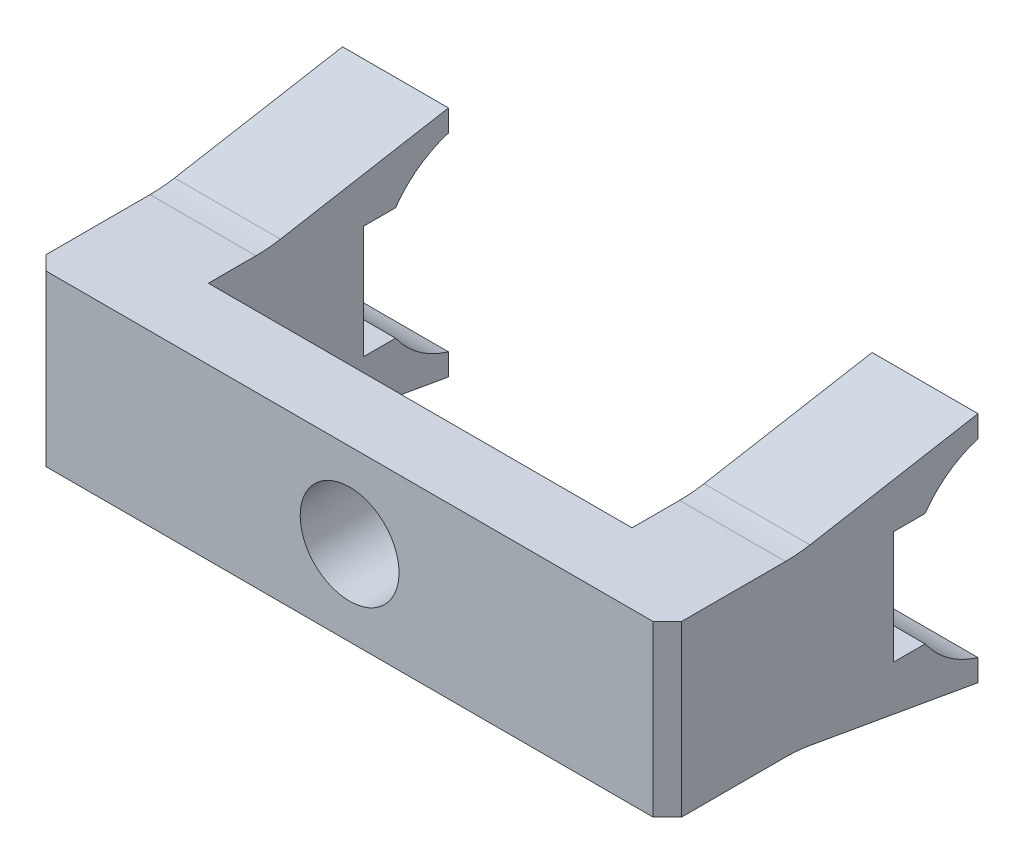
ISO-10303-21;
HEADER;
FILE_DESCRIPTION(('STEP AP214'),'2;1');
FILE_NAME('part.step','',(''),(''),'','','');
FILE_SCHEMA(('AUTOMOTIVE_DESIGN { 1 0 10303 214 1 1 1 1 }'));
ENDSEC;
DATA;
#1=APPLICATION_CONTEXT('core data for automotive mechanical design processes');
#2=APPLICATION_PROTOCOL_DEFINITION('international standard','automotive_design',2000,#1);
#3=PRODUCT_CONTEXT('',#1,'mechanical');
#4=PRODUCT('Part','Part','',(#3));
#5=PRODUCT_RELATED_PRODUCT_CATEGORY('part','',(#4));
#6=PRODUCT_DEFINITION_FORMATION('','',#4);
#7=PRODUCT_DEFINITION_CONTEXT('part definition',#1,'design');
#8=PRODUCT_DEFINITION('design','',#6,#7);
#9=PRODUCT_DEFINITION_SHAPE('','',#8);
#10=(LENGTH_UNIT() NAMED_UNIT(*) SI_UNIT(.MILLI.,.METRE.));
#11=(NAMED_UNIT(*) PLANE_ANGLE_UNIT() SI_UNIT($,.RADIAN.));
#12=(NAMED_UNIT(*) SI_UNIT($,.STERADIAN.) SOLID_ANGLE_UNIT());
#13=UNCERTAINTY_MEASURE_WITH_UNIT(LENGTH_MEASURE(1.E-05),#10,'distance_accuracy_value','');
#14=(GEOMETRIC_REPRESENTATION_CONTEXT(3) GLOBAL_UNCERTAINTY_ASSIGNED_CONTEXT((#13)) GLOBAL_UNIT_ASSIGNED_CONTEXT((#10,
#11,#12)) REPRESENTATION_CONTEXT('',''));
#15=CARTESIAN_POINT('',(0.,0.,0.));
#16=DIRECTION('',(0.,0.,1.));
#17=DIRECTION('',(1.,0.,0.));
#18=AXIS2_PLACEMENT_3D('',#15,#16,#17);
#19=CARTESIAN_POINT('',(0.,0.,0.));
#20=DIRECTION('',(0.,0.,-1.));
#21=DIRECTION('',(-1.,0.,0.));
#22=AXIS2_PLACEMENT_3D('',#19,#20,#21);
#23=PLANE('',#22);
#24=CARTESIAN_POINT('',(0.,0.,0.));
#25=DIRECTION('',(0.,0.,-1.));
#26=DIRECTION('',(-1.,0.,0.));
#27=AXIS2_PLACEMENT_3D('',#24,#25,#26);
#28=CIRCLE('',#27,3.5);
#29=CARTESIAN_POINT('',(-3.5,0.,0.));
#30=VERTEX_POINT('',#29);
#31=EDGE_CURVE('E259',#30,#30,#28,.T.);
#32=ORIENTED_EDGE('',*,*,#31,.F.);
#33=EDGE_LOOP('',(#32));
#34=FACE_BOUND('',#33,.T.);
#35=DIRECTION('',(0.,-1.,0.));
#36=VECTOR('',#35,1.);
#37=CARTESIAN_POINT('',(-15.,6.,0.));
#38=LINE('',#37,#36);
#39=CARTESIAN_POINT('',(-15.,6.,0.));
#40=VERTEX_POINT('',#39);
#41=CARTESIAN_POINT('',(-15.,-6.,0.));
#42=VERTEX_POINT('',#41);
#43=EDGE_CURVE('E272',#40,#42,#38,.T.);
#44=ORIENTED_EDGE('',*,*,#43,.F.);
#45=DIRECTION('',(-1.,0.,0.));
#46=VECTOR('',#45,1.);
#47=CARTESIAN_POINT('',(-22.5,6.,0.));
#48=LINE('',#47,#46);
#49=CARTESIAN_POINT('',(15.,6.,0.));
#50=VERTEX_POINT('',#49);
#51=EDGE_CURVE('E434',#50,#40,#48,.T.);
#52=ORIENTED_EDGE('',*,*,#51,.F.);
#53=DIRECTION('',(0.,-1.,0.));
#54=VECTOR('',#53,1.);
#55=CARTESIAN_POINT('',(15.,6.,0.));
#56=LINE('',#55,#54);
#57=CARTESIAN_POINT('',(15.,-6.,0.));
#58=VERTEX_POINT('',#57);
#59=EDGE_CURVE('E393',#50,#58,#56,.T.);
#60=ORIENTED_EDGE('',*,*,#59,.T.);
#61=DIRECTION('',(1.,0.,0.));
#62=VECTOR('',#61,1.);
#63=CARTESIAN_POINT('',(-22.5,-6.,0.));
#64=LINE('',#63,#62);
#65=EDGE_CURVE('E461',#42,#58,#64,.T.);
#66=ORIENTED_EDGE('',*,*,#65,.F.);
#67=EDGE_LOOP('',(#44,#52,#60,#66));
#68=FACE_BOUND('',#67,.T.);
#69=ADVANCED_FACE('F37',(#34,#68),#23,.T.);
#70=CARTESIAN_POINT('',(22.5,-6.,5.));
#71=DIRECTION('',(-1.,0.,0.));
#72=DIRECTION('',(0.,0.,1.));
#73=AXIS2_PLACEMENT_3D('',#70,#71,#72);
#74=PLANE('',#73);
#75=DIRECTION('',(0.,0.,-1.));
#76=VECTOR('',#75,1.);
#77=CARTESIAN_POINT('',(22.5,6.,5.));
#78=LINE('',#77,#76);
#79=CARTESIAN_POINT('',(22.5,6.,3.99999999999999));
#80=VERTEX_POINT('',#79);
#81=CARTESIAN_POINT('',(22.5,6.,-3.36472927060098));
#82=VERTEX_POINT('',#81);
#83=EDGE_CURVE('E473',#80,#82,#78,.T.);
#84=ORIENTED_EDGE('',*,*,#83,.F.);
#85=DIRECTION('',(0.,-1.,0.));
#86=VECTOR('',#85,1.);
#87=CARTESIAN_POINT('',(22.5,-6.,3.99999999999999));
#88=LINE('',#87,#86);
#89=CARTESIAN_POINT('',(22.5,-6.,3.99999999999999));
#90=VERTEX_POINT('',#89);
#91=EDGE_CURVE('E11',#80,#90,#88,.T.);
#92=ORIENTED_EDGE('',*,*,#91,.T.);
#93=DIRECTION('',(0.,0.,-1.));
#94=VECTOR('',#93,1.);
#95=CARTESIAN_POINT('',(22.5,-6.,5.));
#96=LINE('',#95,#94);
#97=CARTESIAN_POINT('',(22.5,-6.,-3.36472927060098));
#98=VERTEX_POINT('',#97);
#99=EDGE_CURVE('E464',#90,#98,#96,.T.);
#100=ORIENTED_EDGE('',*,*,#99,.T.);
#101=CARTESIAN_POINT('',(22.5,-16.,-3.36472927060098));
#102=DIRECTION('',(-1.,0.,0.));
#103=DIRECTION('',(0.,0.,1.));
#104=AXIS2_PLACEMENT_3D('',#101,#102,#103);
#105=CIRCLE('',#104,10.);
#106=CARTESIAN_POINT('',(22.5,-6.15192246987792,-5.10121104727029));
#107=VERTEX_POINT('',#106);
#108=EDGE_CURVE('E323',#98,#107,#105,.T.);
#109=ORIENTED_EDGE('',*,*,#108,.T.);
#110=DIRECTION('',(0.,-0.173648177666932,-0.984807753012208));
#111=VECTOR('',#110,1.);
#112=CARTESIAN_POINT('',(22.5,-8.25,-17.));
#113=LINE('',#112,#111);
#114=CARTESIAN_POINT('',(22.5,-8.25,-17.));
#115=VERTEX_POINT('',#114);
#116=EDGE_CURVE('E402',#107,#115,#113,.T.);
#117=ORIENTED_EDGE('',*,*,#116,.T.);
#118=DIRECTION('',(0.,1.,0.));
#119=VECTOR('',#118,1.);
#120=CARTESIAN_POINT('',(22.5,-6.70820393249937,-17.));
#121=LINE('',#120,#119);
#122=CARTESIAN_POINT('',(22.5,-6.70820393249937,-17.));
#123=VERTEX_POINT('',#122);
#124=EDGE_CURVE('E405',#115,#123,#121,.T.);
#125=ORIENTED_EDGE('',*,*,#124,.T.);
#126=CARTESIAN_POINT('',(22.5,0.,-19.));
#127=DIRECTION('',(-1.,0.,0.));
#128=DIRECTION('',(0.,0.,-1.));
#129=AXIS2_PLACEMENT_3D('',#126,#127,#128);
#130=CIRCLE('',#129,7.);
#131=CARTESIAN_POINT('',(22.5,-4.,-13.255437353462));
#132=VERTEX_POINT('',#131);
#133=EDGE_CURVE('E408',#123,#132,#130,.T.);
#134=ORIENTED_EDGE('',*,*,#133,.T.);
#135=DIRECTION('',(0.,0.,1.));
#136=VECTOR('',#135,1.);
#137=CARTESIAN_POINT('',(22.5,-4.,-11.));
#138=LINE('',#137,#136);
#139=CARTESIAN_POINT('',(22.5,-4.,-11.));
#140=VERTEX_POINT('',#139);
#141=EDGE_CURVE('E411',#132,#140,#138,.T.);
#142=ORIENTED_EDGE('',*,*,#141,.T.);
#143=DIRECTION('',(0.,1.,0.));
#144=VECTOR('',#143,1.);
#145=CARTESIAN_POINT('',(22.5,4.,-11.));
#146=LINE('',#145,#144);
#147=CARTESIAN_POINT('',(22.5,4.,-11.));
#148=VERTEX_POINT('',#147);
#149=EDGE_CURVE('E414',#140,#148,#146,.T.);
#150=ORIENTED_EDGE('',*,*,#149,.T.);
#151=DIRECTION('',(0.,0.,-1.));
#152=VECTOR('',#151,1.);
#153=CARTESIAN_POINT('',(22.5,4.,-11.));
#154=LINE('',#153,#152);
#155=CARTESIAN_POINT('',(22.5,4.,-13.255437353462));
#156=VERTEX_POINT('',#155);
#157=EDGE_CURVE('E417',#148,#156,#154,.T.);
#158=ORIENTED_EDGE('',*,*,#157,.T.);
#159=CARTESIAN_POINT('',(22.5,0.,-19.));
#160=DIRECTION('',(-1.,0.,0.));
#161=DIRECTION('',(0.,0.,-1.));
#162=AXIS2_PLACEMENT_3D('',#159,#160,#161);
#163=CIRCLE('',#162,7.);
#164=CARTESIAN_POINT('',(22.5,6.70820393249937,-17.));
#165=VERTEX_POINT('',#164);
#166=EDGE_CURVE('E420',#156,#165,#163,.T.);
#167=ORIENTED_EDGE('',*,*,#166,.T.);
#168=DIRECTION('',(0.,1.,0.));
#169=VECTOR('',#168,1.);
#170=CARTESIAN_POINT('',(22.5,8.25,-17.));
#171=LINE('',#170,#169);
#172=CARTESIAN_POINT('',(22.5,8.25,-17.));
#173=VERTEX_POINT('',#172);
#174=EDGE_CURVE('E423',#165,#173,#171,.T.);
#175=ORIENTED_EDGE('',*,*,#174,.T.);
#176=DIRECTION('',(0.,-0.173648177666932,0.984807753012208));
#177=VECTOR('',#176,1.);
#178=CARTESIAN_POINT('',(22.5,8.25,-17.));
#179=LINE('',#178,#177);
#180=CARTESIAN_POINT('',(22.5,6.15192246987792,-5.10121104727028));
#181=VERTEX_POINT('',#180);
#182=EDGE_CURVE('E426',#173,#181,#179,.T.);
#183=ORIENTED_EDGE('',*,*,#182,.T.);
#184=CARTESIAN_POINT('',(22.5,16.,-3.36472927060098));
#185=DIRECTION('',(-1.,0.,0.));
#186=DIRECTION('',(0.,0.,-1.));
#187=AXIS2_PLACEMENT_3D('',#184,#185,#186);
#188=CIRCLE('',#187,10.);
#189=EDGE_CURVE('E360',#181,#82,#188,.T.);
#190=ORIENTED_EDGE('',*,*,#189,.T.);
#191=EDGE_LOOP('',(#84,#92,#100,#109,#117,#125,#134,#142,#150,#158,#167,#175,#183,#190));
#192=FACE_BOUND('',#191,.T.);
#193=ADVANCED_FACE('F522',(#192),#74,.F.);
#194=CARTESIAN_POINT('',(-22.5,6.,5.));
#195=DIRECTION('',(0.,-1.,0.));
#196=DIRECTION('',(1.,0.,0.));
#197=AXIS2_PLACEMENT_3D('',#194,#195,#196);
#198=PLANE('',#197);
#199=DIRECTION('',(0.,0.,-1.));
#200=VECTOR('',#199,1.);
#201=CARTESIAN_POINT('',(-22.5,6.,5.));
#202=LINE('',#201,#200);
#203=CARTESIAN_POINT('',(-22.5,6.,3.99999999999999));
#204=VERTEX_POINT('',#203);
#205=CARTESIAN_POINT('',(-22.5,6.,-3.36472927060098));
#206=VERTEX_POINT('',#205);
#207=EDGE_CURVE('E471',#204,#206,#202,.T.);
#208=ORIENTED_EDGE('',*,*,#207,.F.);
#209=DIRECTION('',(-0.707106781186548,0.,-0.707106781186548));
#210=VECTOR('',#209,1.);
#211=CARTESIAN_POINT('',(-21.5,6.,5.));
#212=LINE('',#211,#210);
#213=CARTESIAN_POINT('',(-21.5,6.,5.));
#214=VERTEX_POINT('',#213);
#215=EDGE_CURVE('E45',#204,#214,#212,.F.);
#216=ORIENTED_EDGE('',*,*,#215,.T.);
#217=DIRECTION('',(-1.,0.,0.));
#218=VECTOR('',#217,1.);
#219=CARTESIAN_POINT('',(-22.5,6.,5.));
#220=LINE('',#219,#218);
#221=CARTESIAN_POINT('',(21.5,6.,5.));
#222=VERTEX_POINT('',#221);
#223=EDGE_CURVE('E457',#222,#214,#220,.T.);
#224=ORIENTED_EDGE('',*,*,#223,.F.);
#225=DIRECTION('',(-0.707106781186548,0.,0.707106781186548));
#226=VECTOR('',#225,1.);
#227=CARTESIAN_POINT('',(21.5,6.,5.));
#228=LINE('',#227,#226);
#229=EDGE_CURVE('E52',#222,#80,#228,.F.);
#230=ORIENTED_EDGE('',*,*,#229,.T.);
#231=ORIENTED_EDGE('',*,*,#83,.T.);
#232=DIRECTION('',(1.,0.,0.));
#233=VECTOR('',#232,1.);
#234=CARTESIAN_POINT('',(15.,6.,-3.36472927060098));
#235=LINE('',#234,#233);
#236=CARTESIAN_POINT('',(15.,6.,-3.36472927060098));
#237=VERTEX_POINT('',#236);
#238=EDGE_CURVE('E435',#237,#82,#235,.T.);
#239=ORIENTED_EDGE('',*,*,#238,.F.);
#240=DIRECTION('',(0.,0.,1.));
#241=VECTOR('',#240,1.);
#242=CARTESIAN_POINT('',(15.,6.,0.));
#243=LINE('',#242,#241);
#244=EDGE_CURVE('E390',#237,#50,#243,.T.);
#245=ORIENTED_EDGE('',*,*,#244,.T.);
#246=ORIENTED_EDGE('',*,*,#51,.T.);
#247=DIRECTION('',(0.,0.,1.));
#248=VECTOR('',#247,1.);
#249=CARTESIAN_POINT('',(-15.,6.,0.));
#250=LINE('',#249,#248);
#251=CARTESIAN_POINT('',(-15.,6.,-3.36472927060098));
#252=VERTEX_POINT('',#251);
#253=EDGE_CURVE('E275',#252,#40,#250,.T.);
#254=ORIENTED_EDGE('',*,*,#253,.F.);
#255=DIRECTION('',(-1.,0.,0.));
#256=VECTOR('',#255,1.);
#257=CARTESIAN_POINT('',(-15.,6.,-3.36472927060098));
#258=LINE('',#257,#256);
#259=EDGE_CURVE('E351',#252,#206,#258,.T.);
#260=ORIENTED_EDGE('',*,*,#259,.T.);
#261=EDGE_LOOP('',(#208,#216,#224,#230,#231,#239,#245,#246,#254,#260));
#262=FACE_BOUND('',#261,.T.);
#263=ADVANCED_FACE('F487',(#262),#198,.F.);
#264=CARTESIAN_POINT('',(-22.5,-6.,5.));
#265=DIRECTION('',(1.,0.,0.));
#266=DIRECTION('',(0.,0.,-1.));
#267=AXIS2_PLACEMENT_3D('',#264,#265,#266);
#268=PLANE('',#267);
#269=DIRECTION('',(0.,0.,-1.));
#270=VECTOR('',#269,1.);
#271=CARTESIAN_POINT('',(-22.5,-6.,5.));
#272=LINE('',#271,#270);
#273=CARTESIAN_POINT('',(-22.5,-6.,3.99999999999999));
#274=VERTEX_POINT('',#273);
#275=CARTESIAN_POINT('',(-22.5,-6.,-3.36472927060098));
#276=VERTEX_POINT('',#275);
#277=EDGE_CURVE('E469',#274,#276,#272,.T.);
#278=ORIENTED_EDGE('',*,*,#277,.F.);
#279=DIRECTION('',(0.,1.,0.));
#280=VECTOR('',#279,1.);
#281=CARTESIAN_POINT('',(-22.5,-6.,3.99999999999999));
#282=LINE('',#281,#280);
#283=EDGE_CURVE('E60',#274,#204,#282,.T.);
#284=ORIENTED_EDGE('',*,*,#283,.T.);
#285=ORIENTED_EDGE('',*,*,#207,.T.);
#286=CARTESIAN_POINT('',(-22.5,16.,-3.36472927060098));
#287=DIRECTION('',(-1.,0.,0.));
#288=DIRECTION('',(0.,0.,-1.));
#289=AXIS2_PLACEMENT_3D('',#286,#287,#288);
#290=CIRCLE('',#289,10.);
#291=CARTESIAN_POINT('',(-22.5,6.15192246987792,-5.10121104727028));
#292=VERTEX_POINT('',#291);
#293=EDGE_CURVE('E300',#292,#206,#290,.T.);
#294=ORIENTED_EDGE('',*,*,#293,.F.);
#295=DIRECTION('',(0.,-0.173648177666932,0.984807753012208));
#296=VECTOR('',#295,1.);
#297=CARTESIAN_POINT('',(-22.5,8.25,-17.));
#298=LINE('',#297,#296);
#299=CARTESIAN_POINT('',(-22.5,8.25,-17.));
#300=VERTEX_POINT('',#299);
#301=EDGE_CURVE('E303',#300,#292,#298,.T.);
#302=ORIENTED_EDGE('',*,*,#301,.F.);
#303=DIRECTION('',(0.,1.,0.));
#304=VECTOR('',#303,1.);
#305=CARTESIAN_POINT('',(-22.5,8.25,-17.));
#306=LINE('',#305,#304);
#307=CARTESIAN_POINT('',(-22.5,6.70820393249937,-17.));
#308=VERTEX_POINT('',#307);
#309=EDGE_CURVE('E305',#308,#300,#306,.T.);
#310=ORIENTED_EDGE('',*,*,#309,.F.);
#311=CARTESIAN_POINT('',(-22.5,0.,-19.));
#312=DIRECTION('',(-1.,0.,0.));
#313=DIRECTION('',(0.,0.,-1.));
#314=AXIS2_PLACEMENT_3D('',#311,#312,#313);
#315=CIRCLE('',#314,7.);
#316=CARTESIAN_POINT('',(-22.5,4.,-13.255437353462));
#317=VERTEX_POINT('',#316);
#318=EDGE_CURVE('E307',#317,#308,#315,.T.);
#319=ORIENTED_EDGE('',*,*,#318,.F.);
#320=DIRECTION('',(0.,0.,-1.));
#321=VECTOR('',#320,1.);
#322=CARTESIAN_POINT('',(-22.5,4.,-11.));
#323=LINE('',#322,#321);
#324=CARTESIAN_POINT('',(-22.5,4.,-11.));
#325=VERTEX_POINT('',#324);
#326=EDGE_CURVE('E309',#325,#317,#323,.T.);
#327=ORIENTED_EDGE('',*,*,#326,.F.);
#328=DIRECTION('',(0.,1.,0.));
#329=VECTOR('',#328,1.);
#330=CARTESIAN_POINT('',(-22.5,4.,-11.));
#331=LINE('',#330,#329);
#332=CARTESIAN_POINT('',(-22.5,-4.,-11.));
#333=VERTEX_POINT('',#332);
#334=EDGE_CURVE('E311',#333,#325,#331,.T.);
#335=ORIENTED_EDGE('',*,*,#334,.F.);
#336=DIRECTION('',(0.,0.,1.));
#337=VECTOR('',#336,1.);
#338=CARTESIAN_POINT('',(-22.5,-4.,-11.));
#339=LINE('',#338,#337);
#340=CARTESIAN_POINT('',(-22.5,-4.,-13.255437353462));
#341=VERTEX_POINT('',#340);
#342=EDGE_CURVE('E313',#341,#333,#339,.T.);
#343=ORIENTED_EDGE('',*,*,#342,.F.);
#344=CARTESIAN_POINT('',(-22.5,0.,-19.));
#345=DIRECTION('',(-1.,0.,0.));
#346=DIRECTION('',(0.,0.,-1.));
#347=AXIS2_PLACEMENT_3D('',#344,#345,#346);
#348=CIRCLE('',#347,7.);
#349=CARTESIAN_POINT('',(-22.5,-6.70820393249937,-17.));
#350=VERTEX_POINT('',#349);
#351=EDGE_CURVE('E315',#350,#341,#348,.T.);
#352=ORIENTED_EDGE('',*,*,#351,.F.);
#353=DIRECTION('',(0.,1.,0.));
#354=VECTOR('',#353,1.);
#355=CARTESIAN_POINT('',(-22.5,-6.70820393249937,-17.));
#356=LINE('',#355,#354);
#357=CARTESIAN_POINT('',(-22.5,-8.25,-17.));
#358=VERTEX_POINT('',#357);
#359=EDGE_CURVE('E317',#358,#350,#356,.T.);
#360=ORIENTED_EDGE('',*,*,#359,.F.);
#361=DIRECTION('',(0.,-0.173648177666932,-0.984807753012208));
#362=VECTOR('',#361,1.);
#363=CARTESIAN_POINT('',(-22.5,-8.25,-17.));
#364=LINE('',#363,#362);
#365=CARTESIAN_POINT('',(-22.5,-6.15192246987792,-5.10121104727029));
#366=VERTEX_POINT('',#365);
#367=EDGE_CURVE('E270',#366,#358,#364,.T.);
#368=ORIENTED_EDGE('',*,*,#367,.F.);
#369=CARTESIAN_POINT('',(-22.5,-16.,-3.36472927060098));
#370=DIRECTION('',(-1.,0.,0.));
#371=DIRECTION('',(0.,0.,1.));
#372=AXIS2_PLACEMENT_3D('',#369,#370,#371);
#373=CIRCLE('',#372,10.);
#374=EDGE_CURVE('E263',#276,#366,#373,.T.);
#375=ORIENTED_EDGE('',*,*,#374,.F.);
#376=EDGE_LOOP('',(#278,#284,#285,#294,#302,#310,#319,#327,#335,#343,#352,#360,#368,#375));
#377=FACE_BOUND('',#376,.T.);
#378=ADVANCED_FACE('F499',(#377),#268,.F.);
#379=CARTESIAN_POINT('',(-22.5,-6.,5.));
#380=DIRECTION('',(0.,1.,0.));
#381=DIRECTION('',(0.,0.,1.));
#382=AXIS2_PLACEMENT_3D('',#379,#380,#381);
#383=PLANE('',#382);
#384=DIRECTION('',(1.,0.,0.));
#385=VECTOR('',#384,1.);
#386=CARTESIAN_POINT('',(-22.5,-6.,5.));
#387=LINE('',#386,#385);
#388=CARTESIAN_POINT('',(-21.5,-6.,5.));
#389=VERTEX_POINT('',#388);
#390=CARTESIAN_POINT('',(21.5,-6.,5.));
#391=VERTEX_POINT('',#390);
#392=EDGE_CURVE('E460',#389,#391,#387,.T.);
#393=ORIENTED_EDGE('',*,*,#392,.F.);
#394=DIRECTION('',(0.707106781186548,0.,0.707106781186548));
#395=VECTOR('',#394,1.);
#396=CARTESIAN_POINT('',(-21.5,-6.,5.));
#397=LINE('',#396,#395);
#398=EDGE_CURVE('E483',#389,#274,#397,.F.);
#399=ORIENTED_EDGE('',*,*,#398,.T.);
#400=ORIENTED_EDGE('',*,*,#277,.T.);
#401=DIRECTION('',(-1.,0.,0.));
#402=VECTOR('',#401,1.);
#403=CARTESIAN_POINT('',(-15.,-6.,-3.36472927060098));
#404=LINE('',#403,#402);
#405=CARTESIAN_POINT('',(-15.,-6.,-3.36472927060098));
#406=VERTEX_POINT('',#405);
#407=EDGE_CURVE('E297',#406,#276,#404,.T.);
#408=ORIENTED_EDGE('',*,*,#407,.F.);
#409=DIRECTION('',(0.,0.,-1.));
#410=VECTOR('',#409,1.);
#411=CARTESIAN_POINT('',(-15.,-6.,0.));
#412=LINE('',#411,#410);
#413=EDGE_CURVE('E269',#42,#406,#412,.T.);
#414=ORIENTED_EDGE('',*,*,#413,.F.);
#415=ORIENTED_EDGE('',*,*,#65,.T.);
#416=DIRECTION('',(0.,0.,-1.));
#417=VECTOR('',#416,1.);
#418=CARTESIAN_POINT('',(15.,-6.,0.));
#419=LINE('',#418,#417);
#420=CARTESIAN_POINT('',(15.,-6.,-3.36472927060098));
#421=VERTEX_POINT('',#420);
#422=EDGE_CURVE('E396',#58,#421,#419,.T.);
#423=ORIENTED_EDGE('',*,*,#422,.T.);
#424=DIRECTION('',(1.,0.,0.));
#425=VECTOR('',#424,1.);
#426=CARTESIAN_POINT('',(15.,-6.,-3.36472927060098));
#427=LINE('',#426,#425);
#428=EDGE_CURVE('E431',#421,#98,#427,.T.);
#429=ORIENTED_EDGE('',*,*,#428,.T.);
#430=ORIENTED_EDGE('',*,*,#99,.F.);
#431=DIRECTION('',(0.707106781186548,0.,-0.707106781186548));
#432=VECTOR('',#431,1.);
#433=CARTESIAN_POINT('',(21.5,-6.,5.));
#434=LINE('',#433,#432);
#435=EDGE_CURVE('E481',#90,#391,#434,.F.);
#436=ORIENTED_EDGE('',*,*,#435,.T.);
#437=EDGE_LOOP('',(#393,#399,#400,#408,#414,#415,#423,#429,#430,#436));
#438=FACE_BOUND('',#437,.T.);
#439=ADVANCED_FACE('F496',(#438),#383,.F.);
#440=CARTESIAN_POINT('',(0.,0.,5.));
#441=DIRECTION('',(0.,0.,-1.));
#442=DIRECTION('',(-1.,0.,0.));
#443=AXIS2_PLACEMENT_3D('',#440,#441,#442);
#444=PLANE('',#443);
#445=CARTESIAN_POINT('',(0.,0.,5.));
#446=DIRECTION('',(0.,0.,-1.));
#447=DIRECTION('',(-1.,0.,0.));
#448=AXIS2_PLACEMENT_3D('',#445,#446,#447);
#449=CIRCLE('',#448,3.5);
#450=CARTESIAN_POINT('',(-3.5,0.,5.));
#451=VERTEX_POINT('',#450);
#452=EDGE_CURVE('E260',#451,#451,#449,.T.);
#453=ORIENTED_EDGE('',*,*,#452,.T.);
#454=EDGE_LOOP('',(#453));
#455=FACE_BOUND('',#454,.T.);
#456=ORIENTED_EDGE('',*,*,#223,.T.);
#457=DIRECTION('',(0.,-1.,0.));
#458=VECTOR('',#457,1.);
#459=CARTESIAN_POINT('',(-21.5,0.,5.));
#460=LINE('',#459,#458);
#461=EDGE_CURVE('E478',#214,#389,#460,.T.);
#462=ORIENTED_EDGE('',*,*,#461,.T.);
#463=ORIENTED_EDGE('',*,*,#392,.T.);
#464=DIRECTION('',(0.,1.,0.));
#465=VECTOR('',#464,1.);
#466=CARTESIAN_POINT('',(21.5,0.,5.));
#467=LINE('',#466,#465);
#468=EDGE_CURVE('E475',#391,#222,#467,.T.);
#469=ORIENTED_EDGE('',*,*,#468,.T.);
#470=EDGE_LOOP('',(#456,#462,#463,#469));
#471=FACE_BOUND('',#470,.T.);
#472=ADVANCED_FACE('F491',(#455,#471),#444,.F.);
#473=CARTESIAN_POINT('',(15.,-16.,-3.36472927060098));
#474=DIRECTION('',(1.,0.,0.));
#475=DIRECTION('',(0.,0.,-1.));
#476=AXIS2_PLACEMENT_3D('',#473,#474,#475);
#477=CYLINDRICAL_SURFACE('',#476,10.);
#478=ORIENTED_EDGE('',*,*,#108,.F.);
#479=ORIENTED_EDGE('',*,*,#428,.F.);
#480=CARTESIAN_POINT('',(15.,-16.,-3.36472927060098));
#481=DIRECTION('',(-1.,0.,0.));
#482=DIRECTION('',(0.,0.,1.));
#483=AXIS2_PLACEMENT_3D('',#480,#481,#482);
#484=CIRCLE('',#483,10.);
#485=CARTESIAN_POINT('',(15.,-6.15192246987792,-5.10121104727029));
#486=VERTEX_POINT('',#485);
#487=EDGE_CURVE('E356',#421,#486,#484,.T.);
#488=ORIENTED_EDGE('',*,*,#487,.T.);
#489=DIRECTION('',(1.,0.,0.));
#490=VECTOR('',#489,1.);
#491=CARTESIAN_POINT('',(15.,-6.15192246987792,-5.10121104727029));
#492=LINE('',#491,#490);
#493=EDGE_CURVE('E399',#486,#107,#492,.T.);
#494=ORIENTED_EDGE('',*,*,#493,.T.);
#495=EDGE_LOOP('',(#478,#479,#488,#494));
#496=FACE_BOUND('',#495,.T.);
#497=ADVANCED_FACE('F562',(#496),#477,.F.);
#498=CARTESIAN_POINT('',(15.,16.,-3.36472927060098));
#499=DIRECTION('',(1.,0.,0.));
#500=DIRECTION('',(0.,0.,-1.));
#501=AXIS2_PLACEMENT_3D('',#498,#499,#500);
#502=CYLINDRICAL_SURFACE('',#501,10.);
#503=ORIENTED_EDGE('',*,*,#189,.F.);
#504=DIRECTION('',(1.,0.,0.));
#505=VECTOR('',#504,1.);
#506=CARTESIAN_POINT('',(15.,6.15192246987792,-5.10121104727028));
#507=LINE('',#506,#505);
#508=CARTESIAN_POINT('',(15.,6.15192246987792,-5.10121104727028));
#509=VERTEX_POINT('',#508);
#510=EDGE_CURVE('E438',#509,#181,#507,.T.);
#511=ORIENTED_EDGE('',*,*,#510,.F.);
#512=CARTESIAN_POINT('',(15.,16.,-3.36472927060098));
#513=DIRECTION('',(-1.,0.,0.));
#514=DIRECTION('',(0.,0.,-1.));
#515=AXIS2_PLACEMENT_3D('',#512,#513,#514);
#516=CIRCLE('',#515,10.);
#517=EDGE_CURVE('E387',#509,#237,#516,.T.);
#518=ORIENTED_EDGE('',*,*,#517,.T.);
#519=ORIENTED_EDGE('',*,*,#238,.T.);
#520=EDGE_LOOP('',(#503,#511,#518,#519));
#521=FACE_BOUND('',#520,.T.);
#522=ADVANCED_FACE('F520',(#521),#502,.F.);
#523=CARTESIAN_POINT('',(15.,8.25,-17.));
#524=DIRECTION('',(0.,0.984807753012208,0.173648177666932));
#525=DIRECTION('',(0.,-0.173648177666932,0.984807753012208));
#526=AXIS2_PLACEMENT_3D('',#523,#524,#525);
#527=PLANE('',#526);
#528=ORIENTED_EDGE('',*,*,#182,.F.);
#529=DIRECTION('',(1.,0.,0.));
#530=VECTOR('',#529,1.);
#531=CARTESIAN_POINT('',(15.,8.25,-17.));
#532=LINE('',#531,#530);
#533=CARTESIAN_POINT('',(15.,8.25,-17.));
#534=VERTEX_POINT('',#533);
#535=EDGE_CURVE('E440',#534,#173,#532,.T.);
#536=ORIENTED_EDGE('',*,*,#535,.F.);
#537=DIRECTION('',(0.,-0.173648177666932,0.984807753012208));
#538=VECTOR('',#537,1.);
#539=CARTESIAN_POINT('',(15.,8.25,-17.));
#540=LINE('',#539,#538);
#541=EDGE_CURVE('E384',#534,#509,#540,.T.);
#542=ORIENTED_EDGE('',*,*,#541,.T.);
#543=ORIENTED_EDGE('',*,*,#510,.T.);
#544=EDGE_LOOP('',(#528,#536,#542,#543));
#545=FACE_BOUND('',#544,.T.);
#546=ADVANCED_FACE('F527',(#545),#527,.T.);
#547=CARTESIAN_POINT('',(15.,8.25,-17.));
#548=DIRECTION('',(0.,0.,-1.));
#549=DIRECTION('',(0.,1.,0.));
#550=AXIS2_PLACEMENT_3D('',#547,#548,#549);
#551=PLANE('',#550);
#552=ORIENTED_EDGE('',*,*,#174,.F.);
#553=DIRECTION('',(1.,0.,0.));
#554=VECTOR('',#553,1.);
#555=CARTESIAN_POINT('',(15.,6.70820393249937,-17.));
#556=LINE('',#555,#554);
#557=CARTESIAN_POINT('',(15.,6.70820393249937,-17.));
#558=VERTEX_POINT('',#557);
#559=EDGE_CURVE('E442',#558,#165,#556,.T.);
#560=ORIENTED_EDGE('',*,*,#559,.F.);
#561=DIRECTION('',(0.,1.,0.));
#562=VECTOR('',#561,1.);
#563=CARTESIAN_POINT('',(15.,8.25,-17.));
#564=LINE('',#563,#562);
#565=EDGE_CURVE('E381',#558,#534,#564,.T.);
#566=ORIENTED_EDGE('',*,*,#565,.T.);
#567=ORIENTED_EDGE('',*,*,#535,.T.);
#568=EDGE_LOOP('',(#552,#560,#566,#567));
#569=FACE_BOUND('',#568,.T.);
#570=ADVANCED_FACE('F532',(#569),#551,.T.);
#571=CARTESIAN_POINT('',(15.,0.,-19.));
#572=DIRECTION('',(1.,0.,0.));
#573=DIRECTION('',(0.,0.,-1.));
#574=AXIS2_PLACEMENT_3D('',#571,#572,#573);
#575=CYLINDRICAL_SURFACE('',#574,7.);
#576=ORIENTED_EDGE('',*,*,#166,.F.);
#577=DIRECTION('',(1.,0.,0.));
#578=VECTOR('',#577,1.);
#579=CARTESIAN_POINT('',(15.,4.,-13.255437353462));
#580=LINE('',#579,#578);
#581=CARTESIAN_POINT('',(15.,4.,-13.255437353462));
#582=VERTEX_POINT('',#581);
#583=EDGE_CURVE('E444',#582,#156,#580,.T.);
#584=ORIENTED_EDGE('',*,*,#583,.F.);
#585=CARTESIAN_POINT('',(15.,0.,-19.));
#586=DIRECTION('',(-1.,0.,0.));
#587=DIRECTION('',(0.,0.,-1.));
#588=AXIS2_PLACEMENT_3D('',#585,#586,#587);
#589=CIRCLE('',#588,7.);
#590=EDGE_CURVE('E378',#582,#558,#589,.T.);
#591=ORIENTED_EDGE('',*,*,#590,.T.);
#592=ORIENTED_EDGE('',*,*,#559,.T.);
#593=EDGE_LOOP('',(#576,#584,#591,#592));
#594=FACE_BOUND('',#593,.T.);
#595=ADVANCED_FACE('F535',(#594),#575,.F.);
#596=CARTESIAN_POINT('',(15.,4.,-11.));
#597=DIRECTION('',(0.,-1.,0.));
#598=DIRECTION('',(0.,0.,-1.));
#599=AXIS2_PLACEMENT_3D('',#596,#597,#598);
#600=PLANE('',#599);
#601=ORIENTED_EDGE('',*,*,#157,.F.);
#602=DIRECTION('',(1.,0.,0.));
#603=VECTOR('',#602,1.);
#604=CARTESIAN_POINT('',(15.,4.,-11.));
#605=LINE('',#604,#603);
#606=CARTESIAN_POINT('',(15.,4.,-11.));
#607=VERTEX_POINT('',#606);
#608=EDGE_CURVE('E446',#607,#148,#605,.T.);
#609=ORIENTED_EDGE('',*,*,#608,.F.);
#610=DIRECTION('',(0.,0.,-1.));
#611=VECTOR('',#610,1.);
#612=CARTESIAN_POINT('',(15.,4.,-11.));
#613=LINE('',#612,#611);
#614=EDGE_CURVE('E375',#607,#582,#613,.T.);
#615=ORIENTED_EDGE('',*,*,#614,.T.);
#616=ORIENTED_EDGE('',*,*,#583,.T.);
#617=EDGE_LOOP('',(#601,#609,#615,#616));
#618=FACE_BOUND('',#617,.T.);
#619=ADVANCED_FACE('F540',(#618),#600,.T.);
#620=CARTESIAN_POINT('',(15.,4.,-11.));
#621=DIRECTION('',(0.,0.,-1.));
#622=DIRECTION('',(0.,1.,0.));
#623=AXIS2_PLACEMENT_3D('',#620,#621,#622);
#624=PLANE('',#623);
#625=CARTESIAN_POINT('',(19.,0.,-11.));
#626=DIRECTION('',(0.,0.,-1.));
#627=DIRECTION('',(0.,1.,0.));
#628=AXIS2_PLACEMENT_3D('',#625,#626,#627);
#629=CIRCLE('',#628,2.49999999999999);
#630=CARTESIAN_POINT('',(19.,2.49999999999999,-11.));
#631=VERTEX_POINT('',#630);
#632=EDGE_CURVE('E248',#631,#631,#629,.T.);
#633=ORIENTED_EDGE('',*,*,#632,.F.);
#634=EDGE_LOOP('',(#633));
#635=FACE_BOUND('',#634,.T.);
#636=ORIENTED_EDGE('',*,*,#149,.F.);
#637=DIRECTION('',(1.,0.,0.));
#638=VECTOR('',#637,1.);
#639=CARTESIAN_POINT('',(15.,-4.,-11.));
#640=LINE('',#639,#638);
#641=CARTESIAN_POINT('',(15.,-4.,-11.));
#642=VERTEX_POINT('',#641);
#643=EDGE_CURVE('E448',#642,#140,#640,.T.);
#644=ORIENTED_EDGE('',*,*,#643,.F.);
#645=DIRECTION('',(0.,1.,0.));
#646=VECTOR('',#645,1.);
#647=CARTESIAN_POINT('',(15.,4.,-11.));
#648=LINE('',#647,#646);
#649=EDGE_CURVE('E372',#642,#607,#648,.T.);
#650=ORIENTED_EDGE('',*,*,#649,.T.);
#651=ORIENTED_EDGE('',*,*,#608,.T.);
#652=EDGE_LOOP('',(#636,#644,#650,#651));
#653=FACE_BOUND('',#652,.T.);
#654=ADVANCED_FACE('F543',(#635,#653),#624,.T.);
#655=CARTESIAN_POINT('',(15.,-4.,-11.));
#656=DIRECTION('',(0.,1.,0.));
#657=DIRECTION('',(0.,0.,1.));
#658=AXIS2_PLACEMENT_3D('',#655,#656,#657);
#659=PLANE('',#658);
#660=ORIENTED_EDGE('',*,*,#141,.F.);
#661=DIRECTION('',(1.,0.,0.));
#662=VECTOR('',#661,1.);
#663=CARTESIAN_POINT('',(15.,-4.,-13.255437353462));
#664=LINE('',#663,#662);
#665=CARTESIAN_POINT('',(15.,-4.,-13.255437353462));
#666=VERTEX_POINT('',#665);
#667=EDGE_CURVE('E450',#666,#132,#664,.T.);
#668=ORIENTED_EDGE('',*,*,#667,.F.);
#669=DIRECTION('',(0.,0.,1.));
#670=VECTOR('',#669,1.);
#671=CARTESIAN_POINT('',(15.,-4.,-11.));
#672=LINE('',#671,#670);
#673=EDGE_CURVE('E369',#666,#642,#672,.T.);
#674=ORIENTED_EDGE('',*,*,#673,.T.);
#675=ORIENTED_EDGE('',*,*,#643,.T.);
#676=EDGE_LOOP('',(#660,#668,#674,#675));
#677=FACE_BOUND('',#676,.T.);
#678=ADVANCED_FACE('F548',(#677),#659,.T.);
#679=CARTESIAN_POINT('',(15.,0.,-19.));
#680=DIRECTION('',(1.,0.,0.));
#681=DIRECTION('',(0.,0.,-1.));
#682=AXIS2_PLACEMENT_3D('',#679,#680,#681);
#683=CYLINDRICAL_SURFACE('',#682,7.);
#684=ORIENTED_EDGE('',*,*,#133,.F.);
#685=DIRECTION('',(1.,0.,0.));
#686=VECTOR('',#685,1.);
#687=CARTESIAN_POINT('',(15.,-6.70820393249937,-17.));
#688=LINE('',#687,#686);
#689=CARTESIAN_POINT('',(15.,-6.70820393249937,-17.));
#690=VERTEX_POINT('',#689);
#691=EDGE_CURVE('E452',#690,#123,#688,.T.);
#692=ORIENTED_EDGE('',*,*,#691,.F.);
#693=CARTESIAN_POINT('',(15.,0.,-19.));
#694=DIRECTION('',(-1.,0.,0.));
#695=DIRECTION('',(0.,0.,-1.));
#696=AXIS2_PLACEMENT_3D('',#693,#694,#695);
#697=CIRCLE('',#696,7.);
#698=EDGE_CURVE('E366',#690,#666,#697,.T.);
#699=ORIENTED_EDGE('',*,*,#698,.T.);
#700=ORIENTED_EDGE('',*,*,#667,.T.);
#701=EDGE_LOOP('',(#684,#692,#699,#700));
#702=FACE_BOUND('',#701,.T.);
#703=ADVANCED_FACE('F551',(#702),#683,.F.);
#704=CARTESIAN_POINT('',(15.,-6.70820393249937,-17.));
#705=DIRECTION('',(0.,0.,-1.));
#706=DIRECTION('',(0.,1.,0.));
#707=AXIS2_PLACEMENT_3D('',#704,#705,#706);
#708=PLANE('',#707);
#709=ORIENTED_EDGE('',*,*,#124,.F.);
#710=DIRECTION('',(1.,0.,0.));
#711=VECTOR('',#710,1.);
#712=CARTESIAN_POINT('',(15.,-8.25,-17.));
#713=LINE('',#712,#711);
#714=CARTESIAN_POINT('',(15.,-8.25,-17.));
#715=VERTEX_POINT('',#714);
#716=EDGE_CURVE('E454',#715,#115,#713,.T.);
#717=ORIENTED_EDGE('',*,*,#716,.F.);
#718=DIRECTION('',(0.,1.,0.));
#719=VECTOR('',#718,1.);
#720=CARTESIAN_POINT('',(15.,-6.70820393249937,-17.));
#721=LINE('',#720,#719);
#722=EDGE_CURVE('E363',#715,#690,#721,.T.);
#723=ORIENTED_EDGE('',*,*,#722,.T.);
#724=ORIENTED_EDGE('',*,*,#691,.T.);
#725=EDGE_LOOP('',(#709,#717,#723,#724));
#726=FACE_BOUND('',#725,.T.);
#727=ADVANCED_FACE('F556',(#726),#708,.T.);
#728=CARTESIAN_POINT('',(15.,-8.25,-17.));
#729=DIRECTION('',(0.,-0.984807753012208,0.173648177666932));
#730=DIRECTION('',(0.,-0.173648177666932,-0.984807753012208));
#731=AXIS2_PLACEMENT_3D('',#728,#729,#730);
#732=PLANE('',#731);
#733=ORIENTED_EDGE('',*,*,#116,.F.);
#734=ORIENTED_EDGE('',*,*,#493,.F.);
#735=DIRECTION('',(0.,-0.173648177666932,-0.984807753012208));
#736=VECTOR('',#735,1.);
#737=CARTESIAN_POINT('',(15.,-8.25,-17.));
#738=LINE('',#737,#736);
#739=EDGE_CURVE('E359',#486,#715,#738,.T.);
#740=ORIENTED_EDGE('',*,*,#739,.T.);
#741=ORIENTED_EDGE('',*,*,#716,.T.);
#742=EDGE_LOOP('',(#733,#734,#740,#741));
#743=FACE_BOUND('',#742,.T.);
#744=ADVANCED_FACE('F559',(#743),#732,.T.);
#745=CARTESIAN_POINT('',(15.,-16.,-3.36472927060098));
#746=DIRECTION('',(-1.,0.,0.));
#747=DIRECTION('',(0.,0.,1.));
#748=AXIS2_PLACEMENT_3D('',#745,#746,#747);
#749=PLANE('',#748);
#750=ORIENTED_EDGE('',*,*,#487,.F.);
#751=ORIENTED_EDGE('',*,*,#422,.F.);
#752=ORIENTED_EDGE('',*,*,#59,.F.);
#753=ORIENTED_EDGE('',*,*,#244,.F.);
#754=ORIENTED_EDGE('',*,*,#517,.F.);
#755=ORIENTED_EDGE('',*,*,#541,.F.);
#756=ORIENTED_EDGE('',*,*,#565,.F.);
#757=ORIENTED_EDGE('',*,*,#590,.F.);
#758=ORIENTED_EDGE('',*,*,#614,.F.);
#759=ORIENTED_EDGE('',*,*,#649,.F.);
#760=ORIENTED_EDGE('',*,*,#673,.F.);
#761=ORIENTED_EDGE('',*,*,#698,.F.);
#762=ORIENTED_EDGE('',*,*,#722,.F.);
#763=ORIENTED_EDGE('',*,*,#739,.F.);
#764=EDGE_LOOP('',(#750,#751,#752,#753,#754,#755,#756,#757,#758,#759,#760,#761,#762,#763));
#765=FACE_BOUND('',#764,.T.);
#766=ADVANCED_FACE('F516',(#765),#749,.T.);
#767=CARTESIAN_POINT('',(-15.,-16.,-3.36472927060098));
#768=DIRECTION('',(-1.,0.,0.));
#769=DIRECTION('',(0.,0.,1.));
#770=AXIS2_PLACEMENT_3D('',#767,#768,#769);
#771=CYLINDRICAL_SURFACE('',#770,10.);
#772=ORIENTED_EDGE('',*,*,#374,.T.);
#773=DIRECTION('',(-1.,0.,0.));
#774=VECTOR('',#773,1.);
#775=CARTESIAN_POINT('',(-15.,-6.15192246987792,-5.10121104727029));
#776=LINE('',#775,#774);
#777=CARTESIAN_POINT('',(-15.,-6.15192246987792,-5.10121104727029));
#778=VERTEX_POINT('',#777);
#779=EDGE_CURVE('E320',#778,#366,#776,.T.);
#780=ORIENTED_EDGE('',*,*,#779,.F.);
#781=CARTESIAN_POINT('',(-15.,-16.,-3.36472927060098));
#782=DIRECTION('',(-1.,0.,0.));
#783=DIRECTION('',(0.,0.,1.));
#784=AXIS2_PLACEMENT_3D('',#781,#782,#783);
#785=CIRCLE('',#784,10.);
#786=EDGE_CURVE('E266',#406,#778,#785,.T.);
#787=ORIENTED_EDGE('',*,*,#786,.F.);
#788=ORIENTED_EDGE('',*,*,#407,.T.);
#789=EDGE_LOOP('',(#772,#780,#787,#788));
#790=FACE_BOUND('',#789,.T.);
#791=ADVANCED_FACE('F503',(#790),#771,.F.);
#792=CARTESIAN_POINT('',(-15.,-8.25,-17.));
#793=DIRECTION('',(0.,0.984807753012208,-0.173648177666932));
#794=DIRECTION('',(0.,0.173648177666932,0.984807753012208));
#795=AXIS2_PLACEMENT_3D('',#792,#793,#794);
#796=PLANE('',#795);
#797=ORIENTED_EDGE('',*,*,#367,.T.);
#798=DIRECTION('',(-1.,0.,0.));
#799=VECTOR('',#798,1.);
#800=CARTESIAN_POINT('',(-15.,-8.25,-17.));
#801=LINE('',#800,#799);
#802=CARTESIAN_POINT('',(-15.,-8.25,-17.));
#803=VERTEX_POINT('',#802);
#804=EDGE_CURVE('E324',#803,#358,#801,.T.);
#805=ORIENTED_EDGE('',*,*,#804,.F.);
#806=DIRECTION('',(0.,-0.173648177666932,-0.984807753012208));
#807=VECTOR('',#806,1.);
#808=CARTESIAN_POINT('',(-15.,-8.25,-17.));
#809=LINE('',#808,#807);
#810=EDGE_CURVE('E295',#778,#803,#809,.T.);
#811=ORIENTED_EDGE('',*,*,#810,.F.);
#812=ORIENTED_EDGE('',*,*,#779,.T.);
#813=EDGE_LOOP('',(#797,#805,#811,#812));
#814=FACE_BOUND('',#813,.T.);
#815=ADVANCED_FACE('F685',(#814),#796,.F.);
#816=CARTESIAN_POINT('',(-15.,-6.70820393249937,-17.));
#817=DIRECTION('',(0.,0.,1.));
#818=DIRECTION('',(0.,-1.,0.));
#819=AXIS2_PLACEMENT_3D('',#816,#817,#818);
#820=PLANE('',#819);
#821=ORIENTED_EDGE('',*,*,#359,.T.);
#822=DIRECTION('',(-1.,0.,0.));
#823=VECTOR('',#822,1.);
#824=CARTESIAN_POINT('',(-15.,-6.70820393249937,-17.));
#825=LINE('',#824,#823);
#826=CARTESIAN_POINT('',(-15.,-6.70820393249937,-17.));
#827=VERTEX_POINT('',#826);
#828=EDGE_CURVE('E327',#827,#350,#825,.T.);
#829=ORIENTED_EDGE('',*,*,#828,.F.);
#830=DIRECTION('',(0.,1.,0.));
#831=VECTOR('',#830,1.);
#832=CARTESIAN_POINT('',(-15.,-6.70820393249937,-17.));
#833=LINE('',#832,#831);
#834=EDGE_CURVE('E293',#803,#827,#833,.T.);
#835=ORIENTED_EDGE('',*,*,#834,.F.);
#836=ORIENTED_EDGE('',*,*,#804,.T.);
#837=EDGE_LOOP('',(#821,#829,#835,#836));
#838=FACE_BOUND('',#837,.T.);
#839=ADVANCED_FACE('F692',(#838),#820,.F.);
#840=CARTESIAN_POINT('',(-15.,0.,-19.));
#841=DIRECTION('',(-1.,0.,0.));
#842=DIRECTION('',(0.,0.,1.));
#843=AXIS2_PLACEMENT_3D('',#840,#841,#842);
#844=CYLINDRICAL_SURFACE('',#843,7.);
#845=ORIENTED_EDGE('',*,*,#351,.T.);
#846=DIRECTION('',(-1.,0.,0.));
#847=VECTOR('',#846,1.);
#848=CARTESIAN_POINT('',(-15.,-4.,-13.255437353462));
#849=LINE('',#848,#847);
#850=CARTESIAN_POINT('',(-15.,-4.,-13.255437353462));
#851=VERTEX_POINT('',#850);
#852=EDGE_CURVE('E330',#851,#341,#849,.T.);
#853=ORIENTED_EDGE('',*,*,#852,.F.);
#854=CARTESIAN_POINT('',(-15.,0.,-19.));
#855=DIRECTION('',(-1.,0.,0.));
#856=DIRECTION('',(0.,0.,-1.));
#857=AXIS2_PLACEMENT_3D('',#854,#855,#856);
#858=CIRCLE('',#857,7.);
#859=EDGE_CURVE('E291',#827,#851,#858,.T.);
#860=ORIENTED_EDGE('',*,*,#859,.F.);
#861=ORIENTED_EDGE('',*,*,#828,.T.);
#862=EDGE_LOOP('',(#845,#853,#860,#861));
#863=FACE_BOUND('',#862,.T.);
#864=ADVANCED_FACE('F700',(#863),#844,.F.);
#865=CARTESIAN_POINT('',(-15.,-4.,-11.));
#866=DIRECTION('',(0.,-1.,0.));
#867=DIRECTION('',(0.,0.,-1.));
#868=AXIS2_PLACEMENT_3D('',#865,#866,#867);
#869=PLANE('',#868);
#870=ORIENTED_EDGE('',*,*,#342,.T.);
#871=DIRECTION('',(-1.,0.,0.));
#872=VECTOR('',#871,1.);
#873=CARTESIAN_POINT('',(-15.,-4.,-11.));
#874=LINE('',#873,#872);
#875=CARTESIAN_POINT('',(-15.,-4.,-11.));
#876=VERTEX_POINT('',#875);
#877=EDGE_CURVE('E333',#876,#333,#874,.T.);
#878=ORIENTED_EDGE('',*,*,#877,.F.);
#879=DIRECTION('',(0.,0.,1.));
#880=VECTOR('',#879,1.);
#881=CARTESIAN_POINT('',(-15.,-4.,-11.));
#882=LINE('',#881,#880);
#883=EDGE_CURVE('E289',#851,#876,#882,.T.);
#884=ORIENTED_EDGE('',*,*,#883,.F.);
#885=ORIENTED_EDGE('',*,*,#852,.T.);
#886=EDGE_LOOP('',(#870,#878,#884,#885));
#887=FACE_BOUND('',#886,.T.);
#888=ADVANCED_FACE('F708',(#887),#869,.F.);
#889=CARTESIAN_POINT('',(-15.,4.,-11.));
#890=DIRECTION('',(0.,0.,1.));
#891=DIRECTION('',(0.,-1.,0.));
#892=AXIS2_PLACEMENT_3D('',#889,#890,#891);
#893=PLANE('',#892);
#894=CARTESIAN_POINT('',(-19.,0.,-11.));
#895=DIRECTION('',(0.,0.,-1.));
#896=DIRECTION('',(0.,1.,0.));
#897=AXIS2_PLACEMENT_3D('',#894,#895,#896);
#898=CIRCLE('',#897,2.49999999999999);
#899=CARTESIAN_POINT('',(-19.,2.49999999999999,-11.));
#900=VERTEX_POINT('',#899);
#901=EDGE_CURVE('E249',#900,#900,#898,.T.);
#902=ORIENTED_EDGE('',*,*,#901,.F.);
#903=EDGE_LOOP('',(#902));
#904=FACE_BOUND('',#903,.T.);
#905=ORIENTED_EDGE('',*,*,#334,.T.);
#906=DIRECTION('',(-1.,0.,0.));
#907=VECTOR('',#906,1.);
#908=CARTESIAN_POINT('',(-15.,4.,-11.));
#909=LINE('',#908,#907);
#910=CARTESIAN_POINT('',(-15.,4.,-11.));
#911=VERTEX_POINT('',#910);
#912=EDGE_CURVE('E336',#911,#325,#909,.T.);
#913=ORIENTED_EDGE('',*,*,#912,.F.);
#914=DIRECTION('',(0.,1.,0.));
#915=VECTOR('',#914,1.);
#916=CARTESIAN_POINT('',(-15.,4.,-11.));
#917=LINE('',#916,#915);
#918=EDGE_CURVE('E287',#876,#911,#917,.T.);
#919=ORIENTED_EDGE('',*,*,#918,.F.);
#920=ORIENTED_EDGE('',*,*,#877,.T.);
#921=EDGE_LOOP('',(#905,#913,#919,#920));
#922=FACE_BOUND('',#921,.T.);
#923=ADVANCED_FACE('F716',(#904,#922),#893,.F.);
#924=CARTESIAN_POINT('',(-15.,4.,-11.));
#925=DIRECTION('',(0.,1.,0.));
#926=DIRECTION('',(0.,0.,1.));
#927=AXIS2_PLACEMENT_3D('',#924,#925,#926);
#928=PLANE('',#927);
#929=ORIENTED_EDGE('',*,*,#326,.T.);
#930=DIRECTION('',(-1.,0.,0.));
#931=VECTOR('',#930,1.);
#932=CARTESIAN_POINT('',(-15.,4.,-13.255437353462));
#933=LINE('',#932,#931);
#934=CARTESIAN_POINT('',(-15.,4.,-13.255437353462));
#935=VERTEX_POINT('',#934);
#936=EDGE_CURVE('E339',#935,#317,#933,.T.);
#937=ORIENTED_EDGE('',*,*,#936,.F.);
#938=DIRECTION('',(0.,0.,-1.));
#939=VECTOR('',#938,1.);
#940=CARTESIAN_POINT('',(-15.,4.,-11.));
#941=LINE('',#940,#939);
#942=EDGE_CURVE('E285',#911,#935,#941,.T.);
#943=ORIENTED_EDGE('',*,*,#942,.F.);
#944=ORIENTED_EDGE('',*,*,#912,.T.);
#945=EDGE_LOOP('',(#929,#937,#943,#944));
#946=FACE_BOUND('',#945,.T.);
#947=ADVANCED_FACE('F725',(#946),#928,.F.);
#948=CARTESIAN_POINT('',(-15.,0.,-19.));
#949=DIRECTION('',(-1.,0.,0.));
#950=DIRECTION('',(0.,0.,1.));
#951=AXIS2_PLACEMENT_3D('',#948,#949,#950);
#952=CYLINDRICAL_SURFACE('',#951,7.);
#953=ORIENTED_EDGE('',*,*,#318,.T.);
#954=DIRECTION('',(-1.,0.,0.));
#955=VECTOR('',#954,1.);
#956=CARTESIAN_POINT('',(-15.,6.70820393249937,-17.));
#957=LINE('',#956,#955);
#958=CARTESIAN_POINT('',(-15.,6.70820393249937,-17.));
#959=VERTEX_POINT('',#958);
#960=EDGE_CURVE('E342',#959,#308,#957,.T.);
#961=ORIENTED_EDGE('',*,*,#960,.F.);
#962=CARTESIAN_POINT('',(-15.,0.,-19.));
#963=DIRECTION('',(-1.,0.,0.));
#964=DIRECTION('',(0.,0.,-1.));
#965=AXIS2_PLACEMENT_3D('',#962,#963,#964);
#966=CIRCLE('',#965,7.);
#967=EDGE_CURVE('E283',#935,#959,#966,.T.);
#968=ORIENTED_EDGE('',*,*,#967,.F.);
#969=ORIENTED_EDGE('',*,*,#936,.T.);
#970=EDGE_LOOP('',(#953,#961,#968,#969));
#971=FACE_BOUND('',#970,.T.);
#972=ADVANCED_FACE('F734',(#971),#952,.F.);
#973=CARTESIAN_POINT('',(-15.,8.25,-17.));
#974=DIRECTION('',(0.,0.,1.));
#975=DIRECTION('',(0.,-1.,0.));
#976=AXIS2_PLACEMENT_3D('',#973,#974,#975);
#977=PLANE('',#976);
#978=ORIENTED_EDGE('',*,*,#309,.T.);
#979=DIRECTION('',(-1.,0.,0.));
#980=VECTOR('',#979,1.);
#981=CARTESIAN_POINT('',(-15.,8.25,-17.));
#982=LINE('',#981,#980);
#983=CARTESIAN_POINT('',(-15.,8.25,-17.));
#984=VERTEX_POINT('',#983);
#985=EDGE_CURVE('E345',#984,#300,#982,.T.);
#986=ORIENTED_EDGE('',*,*,#985,.F.);
#987=DIRECTION('',(0.,1.,0.));
#988=VECTOR('',#987,1.);
#989=CARTESIAN_POINT('',(-15.,8.25,-17.));
#990=LINE('',#989,#988);
#991=EDGE_CURVE('E281',#959,#984,#990,.T.);
#992=ORIENTED_EDGE('',*,*,#991,.F.);
#993=ORIENTED_EDGE('',*,*,#960,.T.);
#994=EDGE_LOOP('',(#978,#986,#992,#993));
#995=FACE_BOUND('',#994,.T.);
#996=ADVANCED_FACE('F742',(#995),#977,.F.);
#997=CARTESIAN_POINT('',(-15.,8.25,-17.));
#998=DIRECTION('',(0.,-0.984807753012208,-0.173648177666932));
#999=DIRECTION('',(0.,0.173648177666932,-0.984807753012208));
#1000=AXIS2_PLACEMENT_3D('',#997,#998,#999);
#1001=PLANE('',#1000);
#1002=ORIENTED_EDGE('',*,*,#301,.T.);
#1003=DIRECTION('',(-1.,0.,0.));
#1004=VECTOR('',#1003,1.);
#1005=CARTESIAN_POINT('',(-15.,6.15192246987792,-5.10121104727028));
#1006=LINE('',#1005,#1004);
#1007=CARTESIAN_POINT('',(-15.,6.15192246987792,-5.10121104727028));
#1008=VERTEX_POINT('',#1007);
#1009=EDGE_CURVE('E348',#1008,#292,#1006,.T.);
#1010=ORIENTED_EDGE('',*,*,#1009,.F.);
#1011=DIRECTION('',(0.,-0.173648177666932,0.984807753012208));
#1012=VECTOR('',#1011,1.);
#1013=CARTESIAN_POINT('',(-15.,8.25,-17.));
#1014=LINE('',#1013,#1012);
#1015=EDGE_CURVE('E279',#984,#1008,#1014,.T.);
#1016=ORIENTED_EDGE('',*,*,#1015,.F.);
#1017=ORIENTED_EDGE('',*,*,#985,.T.);
#1018=EDGE_LOOP('',(#1002,#1010,#1016,#1017));
#1019=FACE_BOUND('',#1018,.T.);
#1020=ADVANCED_FACE('F750',(#1019),#1001,.F.);
#1021=CARTESIAN_POINT('',(-15.,16.,-3.36472927060098));
#1022=DIRECTION('',(-1.,0.,0.));
#1023=DIRECTION('',(0.,0.,1.));
#1024=AXIS2_PLACEMENT_3D('',#1021,#1022,#1023);
#1025=CYLINDRICAL_SURFACE('',#1024,10.);
#1026=ORIENTED_EDGE('',*,*,#293,.T.);
#1027=ORIENTED_EDGE('',*,*,#259,.F.);
#1028=CARTESIAN_POINT('',(-15.,16.,-3.36472927060098));
#1029=DIRECTION('',(-1.,0.,0.));
#1030=DIRECTION('',(0.,0.,-1.));
#1031=AXIS2_PLACEMENT_3D('',#1028,#1029,#1030);
#1032=CIRCLE('',#1031,10.);
#1033=EDGE_CURVE('E277',#1008,#252,#1032,.T.);
#1034=ORIENTED_EDGE('',*,*,#1033,.F.);
#1035=ORIENTED_EDGE('',*,*,#1009,.T.);
#1036=EDGE_LOOP('',(#1026,#1027,#1034,#1035));
#1037=FACE_BOUND('',#1036,.T.);
#1038=ADVANCED_FACE('F758',(#1037),#1025,.F.);
#1039=CARTESIAN_POINT('',(-15.,-16.,-3.36472927060098));
#1040=DIRECTION('',(1.,0.,0.));
#1041=DIRECTION('',(0.,0.,1.));
#1042=AXIS2_PLACEMENT_3D('',#1039,#1040,#1041);
#1043=PLANE('',#1042);
#1044=ORIENTED_EDGE('',*,*,#786,.T.);
#1045=ORIENTED_EDGE('',*,*,#810,.T.);
#1046=ORIENTED_EDGE('',*,*,#834,.T.);
#1047=ORIENTED_EDGE('',*,*,#859,.T.);
#1048=ORIENTED_EDGE('',*,*,#883,.T.);
#1049=ORIENTED_EDGE('',*,*,#918,.T.);
#1050=ORIENTED_EDGE('',*,*,#942,.T.);
#1051=ORIENTED_EDGE('',*,*,#967,.T.);
#1052=ORIENTED_EDGE('',*,*,#991,.T.);
#1053=ORIENTED_EDGE('',*,*,#1015,.T.);
#1054=ORIENTED_EDGE('',*,*,#1033,.T.);
#1055=ORIENTED_EDGE('',*,*,#253,.T.);
#1056=ORIENTED_EDGE('',*,*,#43,.T.);
#1057=ORIENTED_EDGE('',*,*,#413,.T.);
#1058=EDGE_LOOP('',(#1044,#1045,#1046,#1047,#1048,#1049,#1050,#1051,#1052,#1053,#1054,#1055,
#1056,#1057));
#1059=FACE_BOUND('',#1058,.T.);
#1060=ADVANCED_FACE('F509',(#1059),#1043,.T.);
#1061=CARTESIAN_POINT('',(0.,0.,5.));
#1062=DIRECTION('',(0.,0.,-1.));
#1063=DIRECTION('',(-1.,0.,0.));
#1064=AXIS2_PLACEMENT_3D('',#1061,#1062,#1063);
#1065=CYLINDRICAL_SURFACE('',#1064,3.5);
#1066=ORIENTED_EDGE('',*,*,#452,.F.);
#1067=EDGE_LOOP('',(#1066));
#1068=FACE_BOUND('',#1067,.T.);
#1069=ORIENTED_EDGE('',*,*,#31,.T.);
#1070=EDGE_LOOP('',(#1069));
#1071=FACE_BOUND('',#1070,.T.);
#1072=ADVANCED_FACE('F773',(#1068,#1071),#1065,.F.);
#1073=CARTESIAN_POINT('',(19.,0.,0.999999999999999));
#1074=DIRECTION('',(0.,0.,-1.));
#1075=DIRECTION('',(0.,1.,0.));
#1076=AXIS2_PLACEMENT_3D('',#1073,#1074,#1075);
#1077=CONICAL_SURFACE('',#1076,2.5,1.02974425867665);
#1078=CARTESIAN_POINT('',(19.,0.,2.5021515475689));
#1079=VERTEX_POINT('',#1078);
#1080=VERTEX_LOOP('',#1079);
#1081=FACE_BOUND('',#1080,.T.);
#1082=CARTESIAN_POINT('',(19.,0.,0.999999999999999));
#1083=DIRECTION('',(0.,0.,-1.));
#1084=DIRECTION('',(0.,1.,0.));
#1085=AXIS2_PLACEMENT_3D('',#1082,#1083,#1084);
#1086=CIRCLE('',#1085,2.5);
#1087=CARTESIAN_POINT('',(19.,2.5,1.));
#1088=VERTEX_POINT('',#1087);
#1089=EDGE_CURVE('E252',#1088,#1088,#1086,.T.);
#1090=ORIENTED_EDGE('',*,*,#1089,.T.);
#1091=EDGE_LOOP('',(#1090));
#1092=FACE_BOUND('',#1091,.T.);
#1093=ADVANCED_FACE('F779',(#1081,#1092),#1077,.F.);
#1094=CARTESIAN_POINT('',(19.,0.,-11.));
#1095=DIRECTION('',(0.,0.,-1.));
#1096=DIRECTION('',(0.,1.,0.));
#1097=AXIS2_PLACEMENT_3D('',#1094,#1095,#1096);
#1098=CYLINDRICAL_SURFACE('',#1097,2.5);
#1099=ORIENTED_EDGE('',*,*,#1089,.F.);
#1100=EDGE_LOOP('',(#1099));
#1101=FACE_BOUND('',#1100,.T.);
#1102=ORIENTED_EDGE('',*,*,#632,.T.);
#1103=EDGE_LOOP('',(#1102));
#1104=FACE_BOUND('',#1103,.T.);
#1105=ADVANCED_FACE('F242',(#1101,#1104),#1098,.F.);
#1106=CARTESIAN_POINT('',(-19.,0.,0.999999999999999));
#1107=DIRECTION('',(0.,0.,-1.));
#1108=DIRECTION('',(0.,1.,0.));
#1109=AXIS2_PLACEMENT_3D('',#1106,#1107,#1108);
#1110=CONICAL_SURFACE('',#1109,2.5,1.02974425867665);
#1111=CARTESIAN_POINT('',(-19.,0.,2.5021515475689));
#1112=VERTEX_POINT('',#1111);
#1113=VERTEX_LOOP('',#1112);
#1114=FACE_BOUND('',#1113,.T.);
#1115=CARTESIAN_POINT('',(-19.,0.,0.999999999999999));
#1116=DIRECTION('',(0.,0.,-1.));
#1117=DIRECTION('',(0.,1.,0.));
#1118=AXIS2_PLACEMENT_3D('',#1115,#1116,#1117);
#1119=CIRCLE('',#1118,2.5);
#1120=CARTESIAN_POINT('',(-19.,2.5,1.));
#1121=VERTEX_POINT('',#1120);
#1122=EDGE_CURVE('E246',#1121,#1121,#1119,.T.);
#1123=ORIENTED_EDGE('',*,*,#1122,.T.);
#1124=EDGE_LOOP('',(#1123));
#1125=FACE_BOUND('',#1124,.T.);
#1126=ADVANCED_FACE('F238',(#1114,#1125),#1110,.F.);
#1127=CARTESIAN_POINT('',(-19.,0.,-11.));
#1128=DIRECTION('',(0.,0.,-1.));
#1129=DIRECTION('',(0.,1.,0.));
#1130=AXIS2_PLACEMENT_3D('',#1127,#1128,#1129);
#1131=CYLINDRICAL_SURFACE('',#1130,2.5);
#1132=ORIENTED_EDGE('',*,*,#1122,.F.);
#1133=EDGE_LOOP('',(#1132));
#1134=FACE_BOUND('',#1133,.T.);
#1135=ORIENTED_EDGE('',*,*,#901,.T.);
#1136=EDGE_LOOP('',(#1135));
#1137=FACE_BOUND('',#1136,.T.);
#1138=ADVANCED_FACE('F241',(#1134,#1137),#1131,.F.);
#1139=CARTESIAN_POINT('',(-21.5,0.,5.));
#1140=DIRECTION('',(0.707106781186547,0.,-0.707106781186547));
#1141=DIRECTION('',(0.,-1.,0.));
#1142=AXIS2_PLACEMENT_3D('',#1139,#1140,#1141);
#1143=PLANE('',#1142);
#1144=ORIENTED_EDGE('',*,*,#215,.F.);
#1145=ORIENTED_EDGE('',*,*,#283,.F.);
#1146=ORIENTED_EDGE('',*,*,#398,.F.);
#1147=ORIENTED_EDGE('',*,*,#461,.F.);
#1148=EDGE_LOOP('',(#1144,#1145,#1146,#1147));
#1149=FACE_BOUND('',#1148,.T.);
#1150=ADVANCED_FACE('F494',(#1149),#1143,.F.);
#1151=CARTESIAN_POINT('',(21.5,0.,5.));
#1152=DIRECTION('',(-0.707106781186547,0.,-0.707106781186547));
#1153=DIRECTION('',(0.,1.,0.));
#1154=AXIS2_PLACEMENT_3D('',#1151,#1152,#1153);
#1155=PLANE('',#1154);
#1156=ORIENTED_EDGE('',*,*,#435,.F.);
#1157=ORIENTED_EDGE('',*,*,#91,.F.);
#1158=ORIENTED_EDGE('',*,*,#229,.F.);
#1159=ORIENTED_EDGE('',*,*,#468,.F.);
#1160=EDGE_LOOP('',(#1156,#1157,#1158,#1159));
#1161=FACE_BOUND('',#1160,.T.);
#1162=ADVANCED_FACE('F39',(#1161),#1155,.F.);
#1163=CLOSED_SHELL('',(#69,#193,#263,#378,#439,#472,#497,#522,#546,#570,#595,#619,#654,#678,
#703,#727,#744,#766,#791,#815,#839,#864,#888,#923,#947,#972,#996,#1020,#1038,#1060,#1072,#1093,
#1105,#1126,#1138,#1150,#1162));
#1164=MANIFOLD_SOLID_BREP('B2',#1163);
#1165=ADVANCED_BREP_SHAPE_REPRESENTATION('',(#18,#1164),#14);
#1166=SHAPE_DEFINITION_REPRESENTATION(#9,#1165);
ENDSEC;
END-ISO-10303-21;
